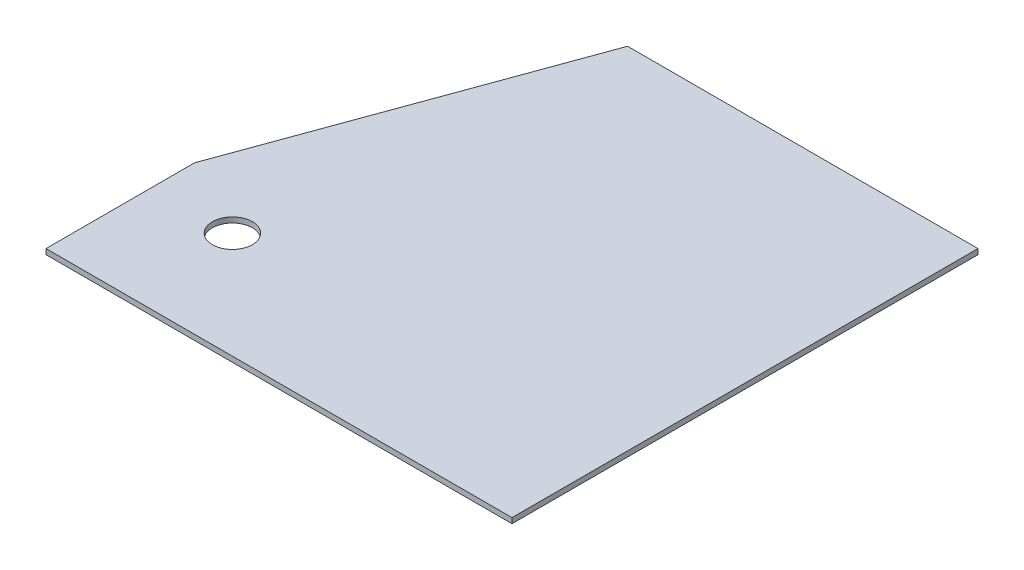
ISO-10303-21;
HEADER;
FILE_DESCRIPTION(('STEP AP214'),'2;1');
FILE_NAME('part.step','',(''),(''),'','','');
FILE_SCHEMA(('AUTOMOTIVE_DESIGN { 1 0 10303 214 1 1 1 1 }'));
ENDSEC;
DATA;
#1=APPLICATION_CONTEXT('core data for automotive mechanical design processes');
#2=APPLICATION_PROTOCOL_DEFINITION('international standard','automotive_design',2000,#1);
#3=PRODUCT_CONTEXT('',#1,'mechanical');
#4=PRODUCT('Part','Part','',(#3));
#5=PRODUCT_RELATED_PRODUCT_CATEGORY('part','',(#4));
#6=PRODUCT_DEFINITION_FORMATION('','',#4);
#7=PRODUCT_DEFINITION_CONTEXT('part definition',#1,'design');
#8=PRODUCT_DEFINITION('design','',#6,#7);
#9=PRODUCT_DEFINITION_SHAPE('','',#8);
#10=(LENGTH_UNIT() NAMED_UNIT(*) SI_UNIT(.MILLI.,.METRE.));
#11=(NAMED_UNIT(*) PLANE_ANGLE_UNIT() SI_UNIT($,.RADIAN.));
#12=(NAMED_UNIT(*) SI_UNIT($,.STERADIAN.) SOLID_ANGLE_UNIT());
#13=UNCERTAINTY_MEASURE_WITH_UNIT(LENGTH_MEASURE(1.E-05),#10,'distance_accuracy_value','');
#14=(GEOMETRIC_REPRESENTATION_CONTEXT(3) GLOBAL_UNCERTAINTY_ASSIGNED_CONTEXT((#13)) GLOBAL_UNIT_ASSIGNED_CONTEXT((#10,
#11,#12)) REPRESENTATION_CONTEXT('',''));
#15=CARTESIAN_POINT('',(0.,0.,0.));
#16=DIRECTION('',(0.,0.,1.));
#17=DIRECTION('',(1.,0.,0.));
#18=AXIS2_PLACEMENT_3D('',#15,#16,#17);
#19=CARTESIAN_POINT('',(-175.,2.,0.));
#20=DIRECTION('',(1.,0.,0.));
#21=DIRECTION('',(0.,0.,-1.));
#22=AXIS2_PLACEMENT_3D('',#19,#20,#21);
#23=PLANE('',#22);
#24=DIRECTION('',(0.,0.,1.));
#25=VECTOR('',#24,1.);
#26=CARTESIAN_POINT('',(-175.,0.,0.));
#27=LINE('',#26,#25);
#28=CARTESIAN_POINT('',(-175.,0.,-55.76));
#29=VERTEX_POINT('',#28);
#30=CARTESIAN_POINT('',(-175.,0.,0.));
#31=VERTEX_POINT('',#30);
#32=EDGE_CURVE('E118',#29,#31,#27,.T.);
#33=ORIENTED_EDGE('',*,*,#32,.T.);
#34=DIRECTION('',(0.,-1.,0.));
#35=VECTOR('',#34,1.);
#36=CARTESIAN_POINT('',(-175.,2.,0.));
#37=LINE('',#36,#35);
#38=CARTESIAN_POINT('',(-175.,2.,0.));
#39=VERTEX_POINT('',#38);
#40=EDGE_CURVE('E11',#39,#31,#37,.T.);
#41=ORIENTED_EDGE('',*,*,#40,.F.);
#42=DIRECTION('',(0.,0.,1.));
#43=VECTOR('',#42,1.);
#44=CARTESIAN_POINT('',(-175.,2.,0.));
#45=LINE('',#44,#43);
#46=CARTESIAN_POINT('',(-175.,2.,-55.76));
#47=VERTEX_POINT('',#46);
#48=EDGE_CURVE('E132',#47,#39,#45,.T.);
#49=ORIENTED_EDGE('',*,*,#48,.F.);
#50=DIRECTION('',(0.,-1.,0.));
#51=VECTOR('',#50,1.);
#52=CARTESIAN_POINT('',(-175.,2.,-55.76));
#53=LINE('',#52,#51);
#54=EDGE_CURVE('E114',#47,#29,#53,.T.);
#55=ORIENTED_EDGE('',*,*,#54,.T.);
#56=EDGE_LOOP('',(#33,#41,#49,#55));
#57=FACE_BOUND('',#56,.T.);
#58=ADVANCED_FACE('F39',(#57),#23,.F.);
#59=CARTESIAN_POINT('',(-175.,2.,0.));
#60=DIRECTION('',(0.,0.,-1.));
#61=DIRECTION('',(-1.,0.,0.));
#62=AXIS2_PLACEMENT_3D('',#59,#60,#61);
#63=PLANE('',#62);
#64=DIRECTION('',(1.,0.,0.));
#65=VECTOR('',#64,1.);
#66=CARTESIAN_POINT('',(-175.,0.,0.));
#67=LINE('',#66,#65);
#68=CARTESIAN_POINT('',(0.,0.,0.));
#69=VERTEX_POINT('',#68);
#70=EDGE_CURVE('E122',#31,#69,#67,.T.);
#71=ORIENTED_EDGE('',*,*,#70,.T.);
#72=DIRECTION('',(0.,-1.,0.));
#73=VECTOR('',#72,1.);
#74=CARTESIAN_POINT('',(0.,2.,0.));
#75=LINE('',#74,#73);
#76=CARTESIAN_POINT('',(0.,2.,0.));
#77=VERTEX_POINT('',#76);
#78=EDGE_CURVE('E48',#77,#69,#75,.T.);
#79=ORIENTED_EDGE('',*,*,#78,.F.);
#80=DIRECTION('',(1.,0.,0.));
#81=VECTOR('',#80,1.);
#82=CARTESIAN_POINT('',(-175.,2.,0.));
#83=LINE('',#82,#81);
#84=EDGE_CURVE('E90',#39,#77,#83,.T.);
#85=ORIENTED_EDGE('',*,*,#84,.F.);
#86=ORIENTED_EDGE('',*,*,#40,.T.);
#87=EDGE_LOOP('',(#71,#79,#85,#86));
#88=FACE_BOUND('',#87,.T.);
#89=ADVANCED_FACE('F155',(#88),#63,.F.);
#90=CARTESIAN_POINT('',(0.,2.,0.));
#91=DIRECTION('',(-1.,0.,0.));
#92=DIRECTION('',(0.,0.,1.));
#93=AXIS2_PLACEMENT_3D('',#90,#91,#92);
#94=PLANE('',#93);
#95=DIRECTION('',(0.,0.,-1.));
#96=VECTOR('',#95,1.);
#97=CARTESIAN_POINT('',(0.,0.,0.));
#98=LINE('',#97,#96);
#99=CARTESIAN_POINT('',(0.,0.,-175.));
#100=VERTEX_POINT('',#99);
#101=EDGE_CURVE('E106',#69,#100,#98,.T.);
#102=ORIENTED_EDGE('',*,*,#101,.T.);
#103=DIRECTION('',(0.,-1.,0.));
#104=VECTOR('',#103,1.);
#105=CARTESIAN_POINT('',(0.,2.,-175.));
#106=LINE('',#105,#104);
#107=CARTESIAN_POINT('',(0.,2.,-175.));
#108=VERTEX_POINT('',#107);
#109=EDGE_CURVE('E103',#108,#100,#106,.T.);
#110=ORIENTED_EDGE('',*,*,#109,.F.);
#111=DIRECTION('',(0.,0.,-1.));
#112=VECTOR('',#111,1.);
#113=CARTESIAN_POINT('',(0.,2.,0.));
#114=LINE('',#113,#112);
#115=EDGE_CURVE('E94',#77,#108,#114,.T.);
#116=ORIENTED_EDGE('',*,*,#115,.F.);
#117=ORIENTED_EDGE('',*,*,#78,.T.);
#118=EDGE_LOOP('',(#102,#110,#116,#117));
#119=FACE_BOUND('',#118,.T.);
#120=ADVANCED_FACE('F104',(#119),#94,.F.);
#121=CARTESIAN_POINT('',(-131.59,2.,-175.));
#122=DIRECTION('',(0.,0.,1.));
#123=DIRECTION('',(1.,0.,0.));
#124=AXIS2_PLACEMENT_3D('',#121,#122,#123);
#125=PLANE('',#124);
#126=DIRECTION('',(-1.,0.,0.));
#127=VECTOR('',#126,1.);
#128=CARTESIAN_POINT('',(-131.59,0.,-175.));
#129=LINE('',#128,#127);
#130=CARTESIAN_POINT('',(-131.59,0.,-175.));
#131=VERTEX_POINT('',#130);
#132=EDGE_CURVE('E76',#100,#131,#129,.T.);
#133=ORIENTED_EDGE('',*,*,#132,.T.);
#134=DIRECTION('',(0.,-1.,0.));
#135=VECTOR('',#134,1.);
#136=CARTESIAN_POINT('',(-131.59,2.,-175.));
#137=LINE('',#136,#135);
#138=CARTESIAN_POINT('',(-131.59,2.,-175.));
#139=VERTEX_POINT('',#138);
#140=EDGE_CURVE('E108',#139,#131,#137,.T.);
#141=ORIENTED_EDGE('',*,*,#140,.F.);
#142=DIRECTION('',(-1.,0.,0.));
#143=VECTOR('',#142,1.);
#144=CARTESIAN_POINT('',(-131.59,2.,-175.));
#145=LINE('',#144,#143);
#146=EDGE_CURVE('E98',#108,#139,#145,.T.);
#147=ORIENTED_EDGE('',*,*,#146,.F.);
#148=ORIENTED_EDGE('',*,*,#109,.T.);
#149=EDGE_LOOP('',(#133,#141,#147,#148));
#150=FACE_BOUND('',#149,.T.);
#151=ADVANCED_FACE('F110',(#150),#125,.F.);
#152=CARTESIAN_POINT('',(-175.,2.,-55.76));
#153=DIRECTION('',(0.939666811419698,0.,0.342091045653547));
#154=DIRECTION('',(0.342091045653547,0.,-0.939666811419699));
#155=AXIS2_PLACEMENT_3D('',#152,#153,#154);
#156=PLANE('',#155);
#157=DIRECTION('',(-0.342091045653547,0.,0.939666811419698));
#158=VECTOR('',#157,1.);
#159=CARTESIAN_POINT('',(-175.,0.,-55.76));
#160=LINE('',#159,#158);
#161=EDGE_CURVE('E82',#131,#29,#160,.T.);
#162=ORIENTED_EDGE('',*,*,#161,.T.);
#163=ORIENTED_EDGE('',*,*,#54,.F.);
#164=DIRECTION('',(-0.342091045653547,0.,0.939666811419698));
#165=VECTOR('',#164,1.);
#166=CARTESIAN_POINT('',(-175.,2.,-55.76));
#167=LINE('',#166,#165);
#168=EDGE_CURVE('E56',#139,#47,#167,.T.);
#169=ORIENTED_EDGE('',*,*,#168,.F.);
#170=ORIENTED_EDGE('',*,*,#140,.T.);
#171=EDGE_LOOP('',(#162,#163,#169,#170));
#172=FACE_BOUND('',#171,.T.);
#173=ADVANCED_FACE('F143',(#172),#156,.F.);
#174=CARTESIAN_POINT('',(0.,2.,0.));
#175=DIRECTION('',(0.,-1.,0.));
#176=DIRECTION('',(0.,0.,-1.));
#177=AXIS2_PLACEMENT_3D('',#174,#175,#176);
#178=PLANE('',#177);
#179=CARTESIAN_POINT('',(-145.,2.,-40.));
#180=DIRECTION('',(0.,-1.,0.));
#181=DIRECTION('',(0.,0.,-1.));
#182=AXIS2_PLACEMENT_3D('',#179,#180,#181);
#183=CIRCLE('',#182,7.50000000000004);
#184=CARTESIAN_POINT('',(-145.,2.,-47.5));
#185=VERTEX_POINT('',#184);
#186=EDGE_CURVE('E123',#185,#185,#183,.T.);
#187=ORIENTED_EDGE('',*,*,#186,.T.);
#188=EDGE_LOOP('',(#187));
#189=FACE_BOUND('',#188,.T.);
#190=ORIENTED_EDGE('',*,*,#48,.T.);
#191=ORIENTED_EDGE('',*,*,#84,.T.);
#192=ORIENTED_EDGE('',*,*,#115,.T.);
#193=ORIENTED_EDGE('',*,*,#146,.T.);
#194=ORIENTED_EDGE('',*,*,#168,.T.);
#195=EDGE_LOOP('',(#190,#191,#192,#193,#194));
#196=FACE_BOUND('',#195,.T.);
#197=ADVANCED_FACE('F96',(#189,#196),#178,.F.);
#198=CARTESIAN_POINT('',(0.,0.,0.));
#199=DIRECTION('',(0.,-1.,0.));
#200=DIRECTION('',(0.,0.,-1.));
#201=AXIS2_PLACEMENT_3D('',#198,#199,#200);
#202=PLANE('',#201);
#203=CARTESIAN_POINT('',(-145.,0.,-40.));
#204=DIRECTION('',(0.,-1.,0.));
#205=DIRECTION('',(0.,0.,-1.));
#206=AXIS2_PLACEMENT_3D('',#203,#204,#205);
#207=CIRCLE('',#206,7.50000000000004);
#208=CARTESIAN_POINT('',(-145.,0.,-47.5));
#209=VERTEX_POINT('',#208);
#210=EDGE_CURVE('E204',#209,#209,#207,.T.);
#211=ORIENTED_EDGE('',*,*,#210,.F.);
#212=EDGE_LOOP('',(#211));
#213=FACE_BOUND('',#212,.T.);
#214=ORIENTED_EDGE('',*,*,#32,.F.);
#215=ORIENTED_EDGE('',*,*,#161,.F.);
#216=ORIENTED_EDGE('',*,*,#132,.F.);
#217=ORIENTED_EDGE('',*,*,#101,.F.);
#218=ORIENTED_EDGE('',*,*,#70,.F.);
#219=EDGE_LOOP('',(#214,#215,#216,#217,#218));
#220=FACE_BOUND('',#219,.T.);
#221=ADVANCED_FACE('F139',(#213,#220),#202,.T.);
#222=CARTESIAN_POINT('',(-145.,10.,-40.));
#223=DIRECTION('',(0.,-1.,0.));
#224=DIRECTION('',(0.,0.,-1.));
#225=AXIS2_PLACEMENT_3D('',#222,#223,#224);
#226=CYLINDRICAL_SURFACE('',#225,7.50000000000004);
#227=ORIENTED_EDGE('',*,*,#210,.T.);
#228=EDGE_LOOP('',(#227));
#229=FACE_BOUND('',#228,.T.);
#230=ORIENTED_EDGE('',*,*,#186,.F.);
#231=EDGE_LOOP('',(#230));
#232=FACE_BOUND('',#231,.T.);
#233=ADVANCED_FACE('F188',(#229,#232),#226,.F.);
#234=CLOSED_SHELL('',(#58,#89,#120,#151,#173,#197,#221,#233));
#235=MANIFOLD_SOLID_BREP('B2',#234);
#236=ADVANCED_BREP_SHAPE_REPRESENTATION('',(#18,#235),#14);
#237=SHAPE_DEFINITION_REPRESENTATION(#9,#236);
ENDSEC;
END-ISO-10303-21;
